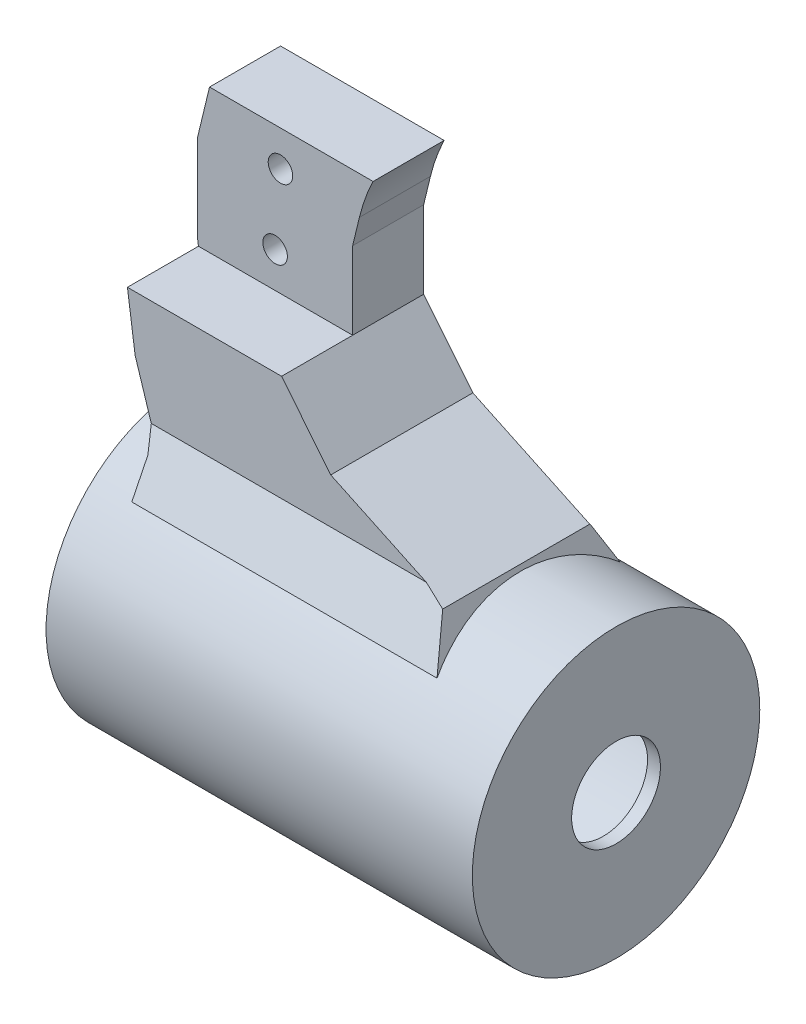
ISO-10303-21;
HEADER;
FILE_DESCRIPTION(('STEP AP214'),'2;1');
FILE_NAME('part.step','',(''),(''),'','','');
FILE_SCHEMA(('AUTOMOTIVE_DESIGN { 1 0 10303 214 1 1 1 1 }'));
ENDSEC;
DATA;
#1=APPLICATION_CONTEXT('core data for automotive mechanical design processes');
#2=APPLICATION_PROTOCOL_DEFINITION('international standard','automotive_design',2000,#1);
#3=PRODUCT_CONTEXT('',#1,'mechanical');
#4=PRODUCT('Part','Part','',(#3));
#5=PRODUCT_RELATED_PRODUCT_CATEGORY('part','',(#4));
#6=PRODUCT_DEFINITION_FORMATION('','',#4);
#7=PRODUCT_DEFINITION_CONTEXT('part definition',#1,'design');
#8=PRODUCT_DEFINITION('design','',#6,#7);
#9=PRODUCT_DEFINITION_SHAPE('','',#8);
#10=(LENGTH_UNIT() NAMED_UNIT(*) SI_UNIT(.MILLI.,.METRE.));
#11=(NAMED_UNIT(*) PLANE_ANGLE_UNIT() SI_UNIT($,.RADIAN.));
#12=(NAMED_UNIT(*) SI_UNIT($,.STERADIAN.) SOLID_ANGLE_UNIT());
#13=UNCERTAINTY_MEASURE_WITH_UNIT(LENGTH_MEASURE(1.E-05),#10,'distance_accuracy_value','');
#14=(GEOMETRIC_REPRESENTATION_CONTEXT(3) GLOBAL_UNCERTAINTY_ASSIGNED_CONTEXT((#13)) GLOBAL_UNIT_ASSIGNED_CONTEXT((#10,
#11,#12)) REPRESENTATION_CONTEXT('',''));
#15=CARTESIAN_POINT('',(0.,0.,0.));
#16=DIRECTION('',(0.,0.,1.));
#17=DIRECTION('',(1.,0.,0.));
#18=AXIS2_PLACEMENT_3D('',#15,#16,#17);
#19=CARTESIAN_POINT('',(-41.8993681465749,-27.4720647034177,0.));
#20=DIRECTION('',(0.,0.,-1.));
#21=DIRECTION('',(-1.,0.,0.));
#22=AXIS2_PLACEMENT_3D('',#19,#20,#21);
#23=PLANE('',#22);
#24=DIRECTION('',(-1.,0.,0.));
#25=VECTOR('',#24,1.);
#26=CARTESIAN_POINT('',(-70.78651792668,-37.0753078944647,0.));
#27=LINE('',#26,#25);
#28=CARTESIAN_POINT('',(-70.78651792668,-37.0753078944647,0.));
#29=VERTEX_POINT('',#28);
#30=CARTESIAN_POINT('',(-94.6542904517229,-37.0753078944647,0.));
#31=VERTEX_POINT('',#30);
#32=EDGE_CURVE('E129',#29,#31,#27,.T.);
#33=ORIENTED_EDGE('',*,*,#32,.F.);
#34=DIRECTION('',(0.,-1.,0.));
#35=VECTOR('',#34,1.);
#36=CARTESIAN_POINT('',(-70.78651792668,-25.0753078944647,0.));
#37=LINE('',#36,#35);
#38=CARTESIAN_POINT('',(-70.78651792668,-25.0753078944647,0.));
#39=VERTEX_POINT('',#38);
#40=EDGE_CURVE('E167',#39,#29,#37,.T.);
#41=ORIENTED_EDGE('',*,*,#40,.F.);
#42=DIRECTION('',(-0.234984789191742,-0.971999047761114,0.));
#43=VECTOR('',#42,1.);
#44=CARTESIAN_POINT('',(-69.738862808107,-20.7417517475428,0.));
#45=LINE('',#44,#43);
#46=CARTESIAN_POINT('',(-69.738862808107,-20.7417517475428,0.));
#47=VERTEX_POINT('',#46);
#48=EDGE_CURVE('E164',#47,#39,#45,.T.);
#49=ORIENTED_EDGE('',*,*,#48,.F.);
#50=CARTESIAN_POINT('',(-41.8993681465749,-27.4720647034177,0.));
#51=DIRECTION('',(0.,0.,1.));
#52=DIRECTION('',(-1.,0.,0.));
#53=AXIS2_PLACEMENT_3D('',#50,#51,#52);
#54=CIRCLE('',#53,28.6414834722905);
#55=CARTESIAN_POINT('',(-67.6192286908768,-14.8695511019509,0.));
#56=VERTEX_POINT('',#55);
#57=EDGE_CURVE('E160',#56,#47,#54,.T.);
#58=ORIENTED_EDGE('',*,*,#57,.F.);
#59=DIRECTION('',(1.,0.,0.));
#60=VECTOR('',#59,1.);
#61=CARTESIAN_POINT('',(-92.9418253522619,-14.8695511019509,0.));
#62=LINE('',#61,#60);
#63=CARTESIAN_POINT('',(-92.9418253522619,-14.8695511019509,0.));
#64=VERTEX_POINT('',#63);
#65=EDGE_CURVE('E156',#64,#56,#62,.T.);
#66=ORIENTED_EDGE('',*,*,#65,.F.);
#67=DIRECTION('',(0.23498478919174,0.971999047761115,0.));
#68=VECTOR('',#67,1.);
#69=CARTESIAN_POINT('',(-94.78651792668,-22.4999999999998,0.));
#70=LINE('',#69,#68);
#71=CARTESIAN_POINT('',(-94.78651792668,-22.4999999999998,0.));
#72=VERTEX_POINT('',#71);
#73=EDGE_CURVE('E152',#72,#64,#70,.T.);
#74=ORIENTED_EDGE('',*,*,#73,.F.);
#75=DIRECTION('',(0.,1.,0.));
#76=VECTOR('',#75,1.);
#77=CARTESIAN_POINT('',(-94.78651792668,-36.1278671988072,0.));
#78=LINE('',#77,#76);
#79=CARTESIAN_POINT('',(-94.78651792668,-36.1278671988072,0.));
#80=VERTEX_POINT('',#79);
#81=EDGE_CURVE('E131',#80,#72,#78,.T.);
#82=ORIENTED_EDGE('',*,*,#81,.F.);
#83=DIRECTION('',(-0.138223150744581,0.990401110963755,0.));
#84=VECTOR('',#83,1.);
#85=CARTESIAN_POINT('',(-94.6542904517229,-37.0753078944647,0.));
#86=LINE('',#85,#84);
#87=EDGE_CURVE('E119',#31,#80,#86,.T.);
#88=ORIENTED_EDGE('',*,*,#87,.F.);
#89=EDGE_LOOP('',(#33,#41,#49,#58,#66,#74,#82,#88));
#90=FACE_BOUND('',#89,.T.);
#91=CARTESIAN_POINT('',(-82.78651792668,-31.5753078944647,0.));
#92=DIRECTION('',(0.,0.,-1.));
#93=DIRECTION('',(-1.,0.,0.));
#94=AXIS2_PLACEMENT_3D('',#91,#92,#93);
#95=CIRCLE('',#94,1.89999999999999);
#96=CARTESIAN_POINT('',(-84.68651792668,-31.5753078944647,0.));
#97=VERTEX_POINT('',#96);
#98=EDGE_CURVE('E143',#97,#97,#95,.T.);
#99=ORIENTED_EDGE('',*,*,#98,.T.);
#100=EDGE_LOOP('',(#99));
#101=FACE_BOUND('',#100,.T.);
#102=CARTESIAN_POINT('',(-81.960177429347,-20.3695511019509,0.));
#103=DIRECTION('',(0.,0.,-1.));
#104=DIRECTION('',(-1.,0.,0.));
#105=AXIS2_PLACEMENT_3D('',#102,#103,#104);
#106=CIRCLE('',#105,1.89999999999999);
#107=CARTESIAN_POINT('',(-83.860177429347,-20.3695511019509,0.));
#108=VERTEX_POINT('',#107);
#109=EDGE_CURVE('E146',#108,#108,#106,.T.);
#110=ORIENTED_EDGE('',*,*,#109,.T.);
#111=EDGE_LOOP('',(#110));
#112=FACE_BOUND('',#111,.T.);
#113=ADVANCED_FACE('F61',(#90,#101,#112),#23,.F.);
#114=CARTESIAN_POINT('',(-70.78651792668,-37.0753078944647,-46.0878503067666));
#115=DIRECTION('',(0.,1.,0.));
#116=DIRECTION('',(0.,0.,1.));
#117=AXIS2_PLACEMENT_3D('',#114,#115,#116);
#118=PLANE('',#117);
#119=DIRECTION('',(0.,0.,1.));
#120=VECTOR('',#119,1.);
#121=CARTESIAN_POINT('',(-94.6542904517229,-37.0753078944647,-46.0878503067666));
#122=LINE('',#121,#120);
#123=CARTESIAN_POINT('',(-94.6542904517229,-37.0753078944647,-11.));
#124=VERTEX_POINT('',#123);
#125=EDGE_CURVE('E116',#124,#31,#122,.T.);
#126=ORIENTED_EDGE('',*,*,#125,.F.);
#127=DIRECTION('',(1.,0.,0.));
#128=VECTOR('',#127,1.);
#129=CARTESIAN_POINT('',(-70.78651792668,-37.0753078944647,-11.));
#130=LINE('',#129,#128);
#131=CARTESIAN_POINT('',(-70.78651792668,-37.0753078944647,-11.));
#132=VERTEX_POINT('',#131);
#133=EDGE_CURVE('E78',#124,#132,#130,.T.);
#134=ORIENTED_EDGE('',*,*,#133,.T.);
#135=DIRECTION('',(0.,0.,1.));
#136=VECTOR('',#135,1.);
#137=CARTESIAN_POINT('',(-70.78651792668,-37.0753078944647,-46.0878503067666));
#138=LINE('',#137,#136);
#139=EDGE_CURVE('E136',#132,#29,#138,.T.);
#140=ORIENTED_EDGE('',*,*,#139,.T.);
#141=ORIENTED_EDGE('',*,*,#32,.T.);
#142=EDGE_LOOP('',(#126,#134,#140,#141));
#143=FACE_BOUND('',#142,.T.);
#144=ADVANCED_FACE('F134',(#143),#118,.F.);
#145=CARTESIAN_POINT('',(-94.6542904517229,-37.0753078944647,-46.0878503067666));
#146=DIRECTION('',(0.990401110963755,0.138223150744581,0.));
#147=DIRECTION('',(-0.138223150744581,0.990401110963755,0.));
#148=AXIS2_PLACEMENT_3D('',#145,#146,#147);
#149=PLANE('',#148);
#150=DIRECTION('',(0.,0.,1.));
#151=VECTOR('',#150,1.);
#152=CARTESIAN_POINT('',(-94.78651792668,-36.1278671988072,-46.0878503067666));
#153=LINE('',#152,#151);
#154=CARTESIAN_POINT('',(-94.78651792668,-36.1278671988072,-11.));
#155=VERTEX_POINT('',#154);
#156=EDGE_CURVE('E111',#155,#80,#153,.T.);
#157=ORIENTED_EDGE('',*,*,#156,.F.);
#158=DIRECTION('',(0.138223150744581,-0.990401110963755,0.));
#159=VECTOR('',#158,1.);
#160=CARTESIAN_POINT('',(-94.6542904517229,-37.0753078944647,-11.));
#161=LINE('',#160,#159);
#162=EDGE_CURVE('E121',#155,#124,#161,.T.);
#163=ORIENTED_EDGE('',*,*,#162,.T.);
#164=ORIENTED_EDGE('',*,*,#125,.T.);
#165=ORIENTED_EDGE('',*,*,#87,.T.);
#166=EDGE_LOOP('',(#157,#163,#164,#165));
#167=FACE_BOUND('',#166,.T.);
#168=ADVANCED_FACE('F118',(#167),#149,.F.);
#169=CARTESIAN_POINT('',(-94.78651792668,-36.1278671988072,-46.0878503067666));
#170=DIRECTION('',(1.,0.,0.));
#171=DIRECTION('',(0.,0.,-1.));
#172=AXIS2_PLACEMENT_3D('',#169,#170,#171);
#173=PLANE('',#172);
#174=DIRECTION('',(0.,0.,1.));
#175=VECTOR('',#174,1.);
#176=CARTESIAN_POINT('',(-94.78651792668,-22.4999999999998,-46.0878503067666));
#177=LINE('',#176,#175);
#178=CARTESIAN_POINT('',(-94.78651792668,-22.4999999999998,-11.));
#179=VERTEX_POINT('',#178);
#180=EDGE_CURVE('E150',#179,#72,#177,.T.);
#181=ORIENTED_EDGE('',*,*,#180,.F.);
#182=DIRECTION('',(0.,-1.,0.));
#183=VECTOR('',#182,1.);
#184=CARTESIAN_POINT('',(-94.78651792668,-36.1278671988072,-11.));
#185=LINE('',#184,#183);
#186=EDGE_CURVE('E132',#179,#155,#185,.T.);
#187=ORIENTED_EDGE('',*,*,#186,.T.);
#188=ORIENTED_EDGE('',*,*,#156,.T.);
#189=ORIENTED_EDGE('',*,*,#81,.T.);
#190=EDGE_LOOP('',(#181,#187,#188,#189));
#191=FACE_BOUND('',#190,.T.);
#192=ADVANCED_FACE('F195',(#191),#173,.F.);
#193=CARTESIAN_POINT('',(-94.78651792668,-22.4999999999998,-46.0878503067666));
#194=DIRECTION('',(0.971999047761115,-0.23498478919174,0.));
#195=DIRECTION('',(0.23498478919174,0.971999047761115,0.));
#196=AXIS2_PLACEMENT_3D('',#193,#194,#195);
#197=PLANE('',#196);
#198=DIRECTION('',(0.,0.,1.));
#199=VECTOR('',#198,1.);
#200=CARTESIAN_POINT('',(-92.9418253522619,-14.8695511019509,-46.0878503067666));
#201=LINE('',#200,#199);
#202=CARTESIAN_POINT('',(-92.9418253522619,-14.8695511019509,-11.));
#203=VERTEX_POINT('',#202);
#204=EDGE_CURVE('E154',#203,#64,#201,.T.);
#205=ORIENTED_EDGE('',*,*,#204,.F.);
#206=DIRECTION('',(-0.23498478919174,-0.971999047761115,0.));
#207=VECTOR('',#206,1.);
#208=CARTESIAN_POINT('',(-94.78651792668,-22.4999999999998,-11.));
#209=LINE('',#208,#207);
#210=EDGE_CURVE('E153',#203,#179,#209,.T.);
#211=ORIENTED_EDGE('',*,*,#210,.T.);
#212=ORIENTED_EDGE('',*,*,#180,.T.);
#213=ORIENTED_EDGE('',*,*,#73,.T.);
#214=EDGE_LOOP('',(#205,#211,#212,#213));
#215=FACE_BOUND('',#214,.T.);
#216=ADVANCED_FACE('F201',(#215),#197,.F.);
#217=CARTESIAN_POINT('',(-92.9418253522619,-14.8695511019509,-46.0878503067666));
#218=DIRECTION('',(0.,-1.,0.));
#219=DIRECTION('',(1.,0.,0.));
#220=AXIS2_PLACEMENT_3D('',#217,#218,#219);
#221=PLANE('',#220);
#222=DIRECTION('',(0.,0.,1.));
#223=VECTOR('',#222,1.);
#224=CARTESIAN_POINT('',(-67.6192286908768,-14.8695511019509,-46.0878503067666));
#225=LINE('',#224,#223);
#226=CARTESIAN_POINT('',(-67.6192286908768,-14.8695511019509,-11.));
#227=VERTEX_POINT('',#226);
#228=EDGE_CURVE('E158',#227,#56,#225,.T.);
#229=ORIENTED_EDGE('',*,*,#228,.F.);
#230=DIRECTION('',(-1.,0.,0.));
#231=VECTOR('',#230,1.);
#232=CARTESIAN_POINT('',(-92.9418253522619,-14.8695511019509,-11.));
#233=LINE('',#232,#231);
#234=EDGE_CURVE('E157',#227,#203,#233,.T.);
#235=ORIENTED_EDGE('',*,*,#234,.T.);
#236=ORIENTED_EDGE('',*,*,#204,.T.);
#237=ORIENTED_EDGE('',*,*,#65,.T.);
#238=EDGE_LOOP('',(#229,#235,#236,#237));
#239=FACE_BOUND('',#238,.T.);
#240=ADVANCED_FACE('F242',(#239),#221,.F.);
#241=CARTESIAN_POINT('',(-41.8993681465749,-27.4720647034177,-46.0878503067666));
#242=DIRECTION('',(0.,0.,1.));
#243=DIRECTION('',(1.,0.,0.));
#244=AXIS2_PLACEMENT_3D('',#241,#242,#243);
#245=CYLINDRICAL_SURFACE('',#244,28.6414834722905);
#246=DIRECTION('',(0.,0.,1.));
#247=VECTOR('',#246,1.);
#248=CARTESIAN_POINT('',(-69.738862808107,-20.7417517475428,-46.0878503067666));
#249=LINE('',#248,#247);
#250=CARTESIAN_POINT('',(-69.738862808107,-20.7417517475428,-11.));
#251=VERTEX_POINT('',#250);
#252=EDGE_CURVE('E162',#251,#47,#249,.T.);
#253=ORIENTED_EDGE('',*,*,#252,.F.);
#254=CARTESIAN_POINT('',(-41.8993681465749,-27.4720647034177,-11.));
#255=DIRECTION('',(0.,0.,1.));
#256=DIRECTION('',(1.,0.,0.));
#257=AXIS2_PLACEMENT_3D('',#254,#255,#256);
#258=CIRCLE('',#257,28.6414834722905);
#259=EDGE_CURVE('E161',#251,#227,#258,.F.);
#260=ORIENTED_EDGE('',*,*,#259,.T.);
#261=ORIENTED_EDGE('',*,*,#228,.T.);
#262=ORIENTED_EDGE('',*,*,#57,.T.);
#263=EDGE_LOOP('',(#253,#260,#261,#262));
#264=FACE_BOUND('',#263,.T.);
#265=ADVANCED_FACE('F215',(#264),#245,.F.);
#266=CARTESIAN_POINT('',(-69.738862808107,-20.7417517475428,-46.0878503067666));
#267=DIRECTION('',(-0.971999047761114,0.234984789191742,0.));
#268=DIRECTION('',(-0.234984789191742,-0.971999047761114,0.));
#269=AXIS2_PLACEMENT_3D('',#266,#267,#268);
#270=PLANE('',#269);
#271=DIRECTION('',(0.,0.,1.));
#272=VECTOR('',#271,1.);
#273=CARTESIAN_POINT('',(-70.78651792668,-25.0753078944647,-46.0878503067666));
#274=LINE('',#273,#272);
#275=CARTESIAN_POINT('',(-70.78651792668,-25.0753078944647,-11.));
#276=VERTEX_POINT('',#275);
#277=EDGE_CURVE('E166',#276,#39,#274,.T.);
#278=ORIENTED_EDGE('',*,*,#277,.F.);
#279=DIRECTION('',(0.234984789191742,0.971999047761114,0.));
#280=VECTOR('',#279,1.);
#281=CARTESIAN_POINT('',(-69.738862808107,-20.7417517475428,-11.));
#282=LINE('',#281,#280);
#283=EDGE_CURVE('E165',#276,#251,#282,.T.);
#284=ORIENTED_EDGE('',*,*,#283,.T.);
#285=ORIENTED_EDGE('',*,*,#252,.T.);
#286=ORIENTED_EDGE('',*,*,#48,.T.);
#287=EDGE_LOOP('',(#278,#284,#285,#286));
#288=FACE_BOUND('',#287,.T.);
#289=ADVANCED_FACE('F216',(#288),#270,.F.);
#290=CARTESIAN_POINT('',(-70.78651792668,-25.0753078944647,-46.0878503067666));
#291=DIRECTION('',(-1.,0.,0.));
#292=DIRECTION('',(0.,0.,1.));
#293=AXIS2_PLACEMENT_3D('',#290,#291,#292);
#294=PLANE('',#293);
#295=ORIENTED_EDGE('',*,*,#139,.F.);
#296=DIRECTION('',(0.,1.,0.));
#297=VECTOR('',#296,1.);
#298=CARTESIAN_POINT('',(-70.78651792668,-25.0753078944647,-11.));
#299=LINE('',#298,#297);
#300=EDGE_CURVE('E168',#132,#276,#299,.T.);
#301=ORIENTED_EDGE('',*,*,#300,.T.);
#302=ORIENTED_EDGE('',*,*,#277,.T.);
#303=ORIENTED_EDGE('',*,*,#40,.T.);
#304=EDGE_LOOP('',(#295,#301,#302,#303));
#305=FACE_BOUND('',#304,.T.);
#306=ADVANCED_FACE('F217',(#305),#294,.F.);
#307=CARTESIAN_POINT('',(-82.78651792668,-31.5753078944647,-46.0878503067666));
#308=DIRECTION('',(0.,0.,1.));
#309=DIRECTION('',(1.,0.,0.));
#310=AXIS2_PLACEMENT_3D('',#307,#308,#309);
#311=CYLINDRICAL_SURFACE('',#310,1.89999999999999);
#312=CARTESIAN_POINT('',(-82.78651792668,-31.5753078944647,-11.));
#313=DIRECTION('',(0.,0.,1.));
#314=DIRECTION('',(1.,0.,0.));
#315=AXIS2_PLACEMENT_3D('',#312,#313,#314);
#316=CIRCLE('',#315,1.89999999999999);
#317=CARTESIAN_POINT('',(-80.88651792668,-31.5753078944647,-11.));
#318=VERTEX_POINT('',#317);
#319=EDGE_CURVE('E12',#318,#318,#316,.T.);
#320=ORIENTED_EDGE('',*,*,#319,.F.);
#321=EDGE_LOOP('',(#320));
#322=FACE_BOUND('',#321,.T.);
#323=ORIENTED_EDGE('',*,*,#98,.F.);
#324=EDGE_LOOP('',(#323));
#325=FACE_BOUND('',#324,.T.);
#326=ADVANCED_FACE('F226',(#322,#325),#311,.F.);
#327=CARTESIAN_POINT('',(-81.960177429347,-20.3695511019509,-46.0878503067666));
#328=DIRECTION('',(0.,0.,1.));
#329=DIRECTION('',(1.,0.,0.));
#330=AXIS2_PLACEMENT_3D('',#327,#328,#329);
#331=CYLINDRICAL_SURFACE('',#330,1.89999999999999);
#332=CARTESIAN_POINT('',(-81.960177429347,-20.3695511019509,-11.));
#333=DIRECTION('',(0.,0.,1.));
#334=DIRECTION('',(1.,0.,0.));
#335=AXIS2_PLACEMENT_3D('',#332,#333,#334);
#336=CIRCLE('',#335,1.89999999999999);
#337=CARTESIAN_POINT('',(-80.060177429347,-20.3695511019509,-11.));
#338=VERTEX_POINT('',#337);
#339=EDGE_CURVE('E65',#338,#338,#336,.T.);
#340=ORIENTED_EDGE('',*,*,#339,.F.);
#341=EDGE_LOOP('',(#340));
#342=FACE_BOUND('',#341,.T.);
#343=ORIENTED_EDGE('',*,*,#109,.F.);
#344=EDGE_LOOP('',(#343));
#345=FACE_BOUND('',#344,.T.);
#346=ADVANCED_FACE('F223',(#342,#345),#331,.F.);
#347=CARTESIAN_POINT('',(0.,0.,-11.));
#348=DIRECTION('',(0.,0.,1.));
#349=DIRECTION('',(1.,0.,0.));
#350=AXIS2_PLACEMENT_3D('',#347,#348,#349);
#351=PLANE('',#350);
#352=ORIENTED_EDGE('',*,*,#339,.T.);
#353=EDGE_LOOP('',(#352));
#354=FACE_BOUND('',#353,.T.);
#355=ORIENTED_EDGE('',*,*,#319,.T.);
#356=EDGE_LOOP('',(#355));
#357=FACE_BOUND('',#356,.T.);
#358=ORIENTED_EDGE('',*,*,#162,.F.);
#359=ORIENTED_EDGE('',*,*,#186,.F.);
#360=ORIENTED_EDGE('',*,*,#210,.F.);
#361=ORIENTED_EDGE('',*,*,#234,.F.);
#362=ORIENTED_EDGE('',*,*,#259,.F.);
#363=ORIENTED_EDGE('',*,*,#283,.F.);
#364=ORIENTED_EDGE('',*,*,#300,.F.);
#365=ORIENTED_EDGE('',*,*,#133,.F.);
#366=EDGE_LOOP('',(#358,#359,#360,#361,#362,#363,#364,#365));
#367=FACE_BOUND('',#366,.T.);
#368=ADVANCED_FACE('F63',(#354,#357,#367),#351,.F.);
#369=CLOSED_SHELL('',(#113,#144,#168,#192,#216,#240,#265,#289,#306,#326,#346,#368));
#370=MANIFOLD_SOLID_BREP('B2',#369);
#371=CARTESIAN_POINT('',(-96.,-78.,0.));
#372=DIRECTION('',(1.,0.,0.));
#373=DIRECTION('',(0.,0.,-1.));
#374=AXIS2_PLACEMENT_3D('',#371,#372,#373);
#375=CYLINDRICAL_SURFACE('',#374,19.15);
#376=CARTESIAN_POINT('',(-96.,-78.,0.));
#377=DIRECTION('',(1.,0.,0.));
#378=DIRECTION('',(0.,0.,-1.));
#379=AXIS2_PLACEMENT_3D('',#376,#377,#378);
#380=CIRCLE('',#379,19.15);
#381=CARTESIAN_POINT('',(-96.,-78.,-19.15));
#382=VERTEX_POINT('',#381);
#383=EDGE_CURVE('E1127',#382,#382,#380,.T.);
#384=ORIENTED_EDGE('',*,*,#383,.F.);
#385=EDGE_LOOP('',(#384));
#386=FACE_BOUND('',#385,.T.);
#387=CARTESIAN_POINT('',(-32.,-78.,0.));
#388=DIRECTION('',(1.,0.,0.));
#389=DIRECTION('',(0.,0.,-1.));
#390=AXIS2_PLACEMENT_3D('',#387,#388,#389);
#391=CIRCLE('',#390,19.15);
#392=CARTESIAN_POINT('',(-32.,-78.,-19.15));
#393=VERTEX_POINT('',#392);
#394=EDGE_CURVE('E59',#393,#393,#391,.F.);
#395=ORIENTED_EDGE('',*,*,#394,.F.);
#396=EDGE_LOOP('',(#395));
#397=FACE_BOUND('',#396,.T.);
#398=ADVANCED_FACE('F332',(#386,#397),#375,.F.);
#399=CARTESIAN_POINT('',(-90.,-99.502,11.));
#400=DIRECTION('',(1.,0.,0.));
#401=DIRECTION('',(0.,1.,0.));
#402=AXIS2_PLACEMENT_3D('',#399,#400,#401);
#403=PLANE('',#402);
#404=DIRECTION('',(0.,-0.896679754505562,-0.442679814154481));
#405=VECTOR('',#404,1.);
#406=CARTESIAN_POINT('',(-90.,-82.0418779550366,-24.3667310961946));
#407=LINE('',#406,#405);
#408=CARTESIAN_POINT('',(-90.,-56.5,-11.7570187329142));
#409=VERTEX_POINT('',#408);
#410=CARTESIAN_POINT('',(-90.,-60.4883017358116,-13.7259944595655));
#411=VERTEX_POINT('',#410);
#412=EDGE_CURVE('E866',#409,#411,#407,.T.);
#413=ORIENTED_EDGE('',*,*,#412,.T.);
#414=CARTESIAN_POINT('',(-90.,-78.,0.));
#415=DIRECTION('',(1.,0.,0.));
#416=DIRECTION('',(0.,0.,-1.));
#417=AXIS2_PLACEMENT_3D('',#414,#415,#416);
#418=CIRCLE('',#417,22.25);
#419=CARTESIAN_POINT('',(-90.,-56.5,-5.72821961869481));
#420=VERTEX_POINT('',#419);
#421=EDGE_CURVE('E348',#411,#420,#418,.T.);
#422=ORIENTED_EDGE('',*,*,#421,.T.);
#423=DIRECTION('',(0.,0.,1.));
#424=VECTOR('',#423,1.);
#425=CARTESIAN_POINT('',(-90.,-56.5,12.4867771165008));
#426=LINE('',#425,#424);
#427=EDGE_CURVE('E799',#409,#420,#426,.T.);
#428=ORIENTED_EDGE('',*,*,#427,.F.);
#429=EDGE_LOOP('',(#413,#422,#428));
#430=FACE_BOUND('',#429,.T.);
#431=ADVANCED_FACE('F881',(#430),#403,.F.);
#432=CARTESIAN_POINT('',(-90.,-56.5,5.72821961869483));
#433=VERTEX_POINT('',#432);
#434=CARTESIAN_POINT('',(-90.,-56.5,12.4867771165008));
#435=VERTEX_POINT('',#434);
#436=EDGE_CURVE('E858',#433,#435,#426,.T.);
#437=ORIENTED_EDGE('',*,*,#436,.F.);
#438=CARTESIAN_POINT('',(-90.,-61.5465446919955,14.9781944314894));
#439=VERTEX_POINT('',#438);
#440=EDGE_CURVE('E1118',#433,#439,#418,.T.);
#441=ORIENTED_EDGE('',*,*,#440,.T.);
#442=DIRECTION('',(0.,0.896679754505563,-0.442679814154478));
#443=VECTOR('',#442,1.);
#444=CARTESIAN_POINT('',(-90.,-90.4849307787501,29.2647212661215));
#445=LINE('',#444,#443);
#446=EDGE_CURVE('E433',#439,#435,#445,.T.);
#447=ORIENTED_EDGE('',*,*,#446,.T.);
#448=EDGE_LOOP('',(#437,#441,#447));
#449=FACE_BOUND('',#448,.T.);
#450=ADVANCED_FACE('F915',(#449),#403,.F.);
#451=CARTESIAN_POINT('',(-29.471892703518,-62.4156191809848,11.));
#452=DIRECTION('',(0.42698083978432,0.904260671740775,0.));
#453=DIRECTION('',(0.,0.,-1.));
#454=AXIS2_PLACEMENT_3D('',#451,#452,#453);
#455=PLANE('',#454);
#456=DIRECTION('',(0.,0.,-1.));
#457=VECTOR('',#456,1.);
#458=CARTESIAN_POINT('',(-45.0744862839186,-55.0482651447333,0.));
#459=LINE('',#458,#457);
#460=CARTESIAN_POINT('',(-45.0744862839186,-55.0482651447333,11.7700733962463));
#461=VERTEX_POINT('',#460);
#462=CARTESIAN_POINT('',(-45.0744862839186,-55.0482651447333,-11.0403150126597));
#463=VERTEX_POINT('',#462);
#464=EDGE_CURVE('E686',#461,#463,#459,.T.);
#465=ORIENTED_EDGE('',*,*,#464,.T.);
#466=DIRECTION('',(-0.884816093206044,0.417799347398912,0.206262421484466));
#467=VECTOR('',#466,1.);
#468=CARTESIAN_POINT('',(-86.5473912286674,-35.4652661987385,-1.37242824434456));
#469=LINE('',#468,#467);
#470=CARTESIAN_POINT('',(-45.2474279751019,-54.966604191379,-11.));
#471=VERTEX_POINT('',#470);
#472=EDGE_CURVE('E870',#463,#471,#469,.T.);
#473=ORIENTED_EDGE('',*,*,#472,.T.);
#474=DIRECTION('',(0.904260671740775,-0.42698083978432,0.));
#475=VECTOR('',#474,1.);
#476=CARTESIAN_POINT('',(-29.471892703518,-62.4156191809848,-11.));
#477=LINE('',#476,#475);
#478=CARTESIAN_POINT('',(-63.1780152054959,-46.5,-11.));
#479=VERTEX_POINT('',#478);
#480=EDGE_CURVE('E432',#479,#471,#477,.T.);
#481=ORIENTED_EDGE('',*,*,#480,.F.);
#482=DIRECTION('',(0.,0.,-1.));
#483=VECTOR('',#482,1.);
#484=CARTESIAN_POINT('',(-63.1780152054959,-46.5,11.));
#485=LINE('',#484,#483);
#486=CARTESIAN_POINT('',(-63.1780152054959,-46.5,11.));
#487=VERTEX_POINT('',#486);
#488=EDGE_CURVE('E448',#487,#479,#485,.T.);
#489=ORIENTED_EDGE('',*,*,#488,.F.);
#490=DIRECTION('',(0.904260671740775,-0.42698083978432,0.));
#491=VECTOR('',#490,1.);
#492=CARTESIAN_POINT('',(-29.471892703518,-62.4156191809848,11.));
#493=LINE('',#492,#491);
#494=CARTESIAN_POINT('',(-48.3779156194455,-53.4884261780158,11.));
#495=VERTEX_POINT('',#494);
#496=EDGE_CURVE('E446',#487,#495,#493,.T.);
#497=ORIENTED_EDGE('',*,*,#496,.T.);
#498=DIRECTION('',(0.884816093206045,-0.417799347398913,0.206262421484465));
#499=VECTOR('',#498,1.);
#500=CARTESIAN_POINT('',(-87.2270216026564,-35.1443530407328,1.94375573169227));
#501=LINE('',#500,#499);
#502=EDGE_CURVE('E798',#495,#461,#501,.T.);
#503=ORIENTED_EDGE('',*,*,#502,.T.);
#504=EDGE_LOOP('',(#465,#473,#481,#489,#497,#503));
#505=FACE_BOUND('',#504,.T.);
#506=ADVANCED_FACE('F836',(#505),#455,.T.);
#507=CARTESIAN_POINT('',(-60.9770040591636,-49.2264040160328,11.));
#508=DIRECTION('',(0.778092434340065,0.628149793936726,0.));
#509=DIRECTION('',(0.,0.,-1.));
#510=AXIS2_PLACEMENT_3D('',#507,#508,#509);
#511=PLANE('',#510);
#512=DIRECTION('',(0.628149793936726,-0.778092434340065,0.));
#513=VECTOR('',#512,1.);
#514=CARTESIAN_POINT('',(-60.9770040591636,-49.2264040160328,-11.));
#515=LINE('',#514,#513);
#516=CARTESIAN_POINT('',(-70.78651792668,-37.0753078944647,-11.));
#517=VERTEX_POINT('',#516);
#518=EDGE_CURVE('E429',#517,#479,#515,.T.);
#519=ORIENTED_EDGE('',*,*,#518,.F.);
#520=DIRECTION('',(0.,0.,1.));
#521=VECTOR('',#520,1.);
#522=CARTESIAN_POINT('',(-70.78651792668,-37.0753078944647,0.));
#523=LINE('',#522,#521);
#524=CARTESIAN_POINT('',(-70.78651792668,-37.0753078944647,11.));
#525=VERTEX_POINT('',#524);
#526=EDGE_CURVE('E422',#517,#525,#523,.T.);
#527=ORIENTED_EDGE('',*,*,#526,.T.);
#528=DIRECTION('',(0.628149793936726,-0.778092434340065,0.));
#529=VECTOR('',#528,1.);
#530=CARTESIAN_POINT('',(-60.9770040591636,-49.2264040160328,11.));
#531=LINE('',#530,#529);
#532=EDGE_CURVE('E426',#525,#487,#531,.T.);
#533=ORIENTED_EDGE('',*,*,#532,.T.);
#534=ORIENTED_EDGE('',*,*,#488,.T.);
#535=EDGE_LOOP('',(#519,#527,#533,#534));
#536=FACE_BOUND('',#535,.T.);
#537=ADVANCED_FACE('F424',(#536),#511,.T.);
#538=CARTESIAN_POINT('',(0.,0.,11.));
#539=DIRECTION('',(0.,0.,1.));
#540=DIRECTION('',(1.,0.,0.));
#541=AXIS2_PLACEMENT_3D('',#538,#539,#540);
#542=PLANE('',#541);
#543=DIRECTION('',(1.,0.,0.));
#544=VECTOR('',#543,1.);
#545=CARTESIAN_POINT('',(-70.78651792668,-37.0753078944647,11.));
#546=LINE('',#545,#544);
#547=CARTESIAN_POINT('',(-94.6542904517229,-37.0753078944647,11.));
#548=VERTEX_POINT('',#547);
#549=EDGE_CURVE('E436',#548,#525,#546,.T.);
#550=ORIENTED_EDGE('',*,*,#549,.F.);
#551=DIRECTION('',(0.138223150744598,-0.990401110963753,0.));
#552=VECTOR('',#551,1.);
#553=CARTESIAN_POINT('',(-97.9213344834683,-13.6661754793973,11.));
#554=LINE('',#553,#552);
#555=CARTESIAN_POINT('',(-93.4649708547694,-45.5970601752398,11.));
#556=VERTEX_POINT('',#555);
#557=EDGE_CURVE('E872',#548,#556,#554,.T.);
#558=ORIENTED_EDGE('',*,*,#557,.T.);
#559=DIRECTION('',(0.302874523533555,-0.953030441798331,0.));
#560=VECTOR('',#559,1.);
#561=CARTESIAN_POINT('',(-98.0526802844433,-31.1612908883586,11.));
#562=LINE('',#561,#560);
#563=CARTESIAN_POINT('',(-90.9570827398739,-53.4884261780158,11.));
#564=VERTEX_POINT('',#563);
#565=EDGE_CURVE('E454',#564,#556,#562,.F.);
#566=ORIENTED_EDGE('',*,*,#565,.F.);
#567=DIRECTION('',(1.,0.,0.));
#568=VECTOR('',#567,1.);
#569=CARTESIAN_POINT('',(-42.,-53.4884261780158,11.));
#570=LINE('',#569,#568);
#571=EDGE_CURVE('E460',#564,#495,#570,.T.);
#572=ORIENTED_EDGE('',*,*,#571,.T.);
#573=ORIENTED_EDGE('',*,*,#496,.F.);
#574=ORIENTED_EDGE('',*,*,#532,.F.);
#575=EDGE_LOOP('',(#550,#558,#566,#572,#573,#574));
#576=FACE_BOUND('',#575,.T.);
#577=ADVANCED_FACE('F444',(#576),#542,.T.);
#578=CARTESIAN_POINT('',(0.,0.,-11.));
#579=DIRECTION('',(0.,0.,1.));
#580=DIRECTION('',(1.,0.,0.));
#581=AXIS2_PLACEMENT_3D('',#578,#579,#580);
#582=PLANE('',#581);
#583=DIRECTION('',(-0.302874523533555,0.953030441798331,0.));
#584=VECTOR('',#583,1.);
#585=CARTESIAN_POINT('',(-90.,-56.5,-11.));
#586=LINE('',#585,#584);
#587=CARTESIAN_POINT('',(-93.4649708547694,-45.5970601752398,-11.));
#588=VERTEX_POINT('',#587);
#589=CARTESIAN_POINT('',(-90.4873155195841,-54.966604191379,-11.));
#590=VERTEX_POINT('',#589);
#591=EDGE_CURVE('E463',#588,#590,#586,.F.);
#592=ORIENTED_EDGE('',*,*,#591,.F.);
#593=DIRECTION('',(-0.138223150744598,0.990401110963753,0.));
#594=VECTOR('',#593,1.);
#595=CARTESIAN_POINT('',(-94.78651792668,-36.1278671988072,-11.));
#596=LINE('',#595,#594);
#597=CARTESIAN_POINT('',(-94.6542904517229,-37.0753078944647,-11.));
#598=VERTEX_POINT('',#597);
#599=EDGE_CURVE('E356',#588,#598,#596,.T.);
#600=ORIENTED_EDGE('',*,*,#599,.T.);
#601=DIRECTION('',(-1.,0.,0.));
#602=VECTOR('',#601,1.);
#603=CARTESIAN_POINT('',(-70.78651792668,-37.0753078944647,-11.));
#604=LINE('',#603,#602);
#605=EDGE_CURVE('E886',#517,#598,#604,.T.);
#606=ORIENTED_EDGE('',*,*,#605,.F.);
#607=ORIENTED_EDGE('',*,*,#518,.T.);
#608=ORIENTED_EDGE('',*,*,#480,.T.);
#609=DIRECTION('',(-1.,0.,0.));
#610=VECTOR('',#609,1.);
#611=CARTESIAN_POINT('',(0.,-54.966604191379,-11.));
#612=LINE('',#611,#610);
#613=EDGE_CURVE('E861',#471,#590,#612,.T.);
#614=ORIENTED_EDGE('',*,*,#613,.T.);
#615=EDGE_LOOP('',(#592,#600,#606,#607,#608,#614));
#616=FACE_BOUND('',#615,.T.);
#617=ADVANCED_FACE('F885',(#616),#582,.F.);
#618=CARTESIAN_POINT('',(-98.,-53.4884261780158,11.));
#619=DIRECTION('',(0.,0.442679814154478,0.896679754505563));
#620=DIRECTION('',(1.,0.,0.));
#621=AXIS2_PLACEMENT_3D('',#618,#619,#620);
#622=PLANE('',#621);
#623=DIRECTION('',(1.,0.,0.));
#624=VECTOR('',#623,1.);
#625=CARTESIAN_POINT('',(-94.78651792668,-61.5465446919955,14.9781944314894));
#626=LINE('',#625,#624);
#627=CARTESIAN_POINT('',(-42.7447078451662,-61.5465446919955,14.9781944314894));
#628=VERTEX_POINT('',#627);
#629=EDGE_CURVE('E842',#628,#439,#626,.F.);
#630=ORIENTED_EDGE('',*,*,#629,.F.);
#631=DIRECTION('',(-0.30605332364349,0.85365201270775,-0.421437544942048));
#632=VECTOR('',#631,1.);
#633=CARTESIAN_POINT('',(-45.1738121689698,-54.7712227631035,11.6333009650672));
#634=LINE('',#633,#632);
#635=EDGE_CURVE('E794',#628,#461,#634,.T.);
#636=ORIENTED_EDGE('',*,*,#635,.T.);
#637=ORIENTED_EDGE('',*,*,#502,.F.);
#638=ORIENTED_EDGE('',*,*,#571,.F.);
#639=DIRECTION('',(-0.274055906121885,0.862349260154414,-0.425731269500899));
#640=VECTOR('',#639,1.);
#641=CARTESIAN_POINT('',(-90.,-56.5,12.4867771165008));
#642=LINE('',#641,#640);
#643=EDGE_CURVE('E853',#564,#435,#642,.F.);
#644=ORIENTED_EDGE('',*,*,#643,.T.);
#645=ORIENTED_EDGE('',*,*,#446,.F.);
#646=EDGE_LOOP('',(#630,#636,#637,#638,#644,#645));
#647=FACE_BOUND('',#646,.T.);
#648=ADVANCED_FACE('F839',(#647),#622,.T.);
#649=CARTESIAN_POINT('',(-45.0744862839186,-55.0482651447333,11.));
#650=DIRECTION('',(0.941329900196425,0.337487805699981,0.));
#651=DIRECTION('',(0.,0.,-1.));
#652=AXIS2_PLACEMENT_3D('',#649,#650,#651);
#653=PLANE('',#652);
#654=CARTESIAN_POINT('',(-36.8457764217381,-78.,0.));
#655=DIRECTION('',(0.941329900196425,0.337487805699981,0.));
#656=DIRECTION('',(0.337487805699981,-0.941329900196425,0.));
#657=AXIS2_PLACEMENT_3D('',#654,#655,#656);
#658=ELLIPSE('',#657,23.6367717580809,22.25);
#659=CARTESIAN_POINT('',(-43.1241115941658,-60.4883017358116,-13.7259944595655));
#660=VERTEX_POINT('',#659);
#661=EDGE_CURVE('E846',#660,#628,#658,.T.);
#662=ORIENTED_EDGE('',*,*,#661,.F.);
#663=DIRECTION('',(-0.30605332364349,0.853652012707749,0.42143754494205));
#664=VECTOR('',#663,1.);
#665=CARTESIAN_POINT('',(-50.0584819257399,-41.1467728808446,-4.1773185181737));
#666=LINE('',#665,#664);
#667=EDGE_CURVE('E848',#660,#463,#666,.T.);
#668=ORIENTED_EDGE('',*,*,#667,.T.);
#669=ORIENTED_EDGE('',*,*,#464,.F.);
#670=ORIENTED_EDGE('',*,*,#635,.F.);
#671=EDGE_LOOP('',(#662,#668,#669,#670));
#672=FACE_BOUND('',#671,.T.);
#673=ADVANCED_FACE('F845',(#672),#653,.T.);
#674=CARTESIAN_POINT('',(-90.,-56.5,12.4867771165008));
#675=DIRECTION('',(-0.953030441798331,-0.302874523533555,0.));
#676=DIRECTION('',(0.302874523533555,-0.953030441798331,0.));
#677=AXIS2_PLACEMENT_3D('',#674,#675,#676);
#678=PLANE('',#677);
#679=ORIENTED_EDGE('',*,*,#427,.T.);
#680=CARTESIAN_POINT('',(-83.1672673081839,-78.,0.));
#681=DIRECTION('',(-0.953030441798331,-0.302874523533555,0.));
#682=DIRECTION('',(0.302874523533555,-0.953030441798331,0.));
#683=AXIS2_PLACEMENT_3D('',#680,#681,#682);
#684=ELLIPSE('',#683,23.3465784765648,22.25);
#685=EDGE_CURVE('E1116',#420,#433,#684,.F.);
#686=ORIENTED_EDGE('',*,*,#685,.T.);
#687=ORIENTED_EDGE('',*,*,#436,.T.);
#688=ORIENTED_EDGE('',*,*,#643,.F.);
#689=ORIENTED_EDGE('',*,*,#565,.T.);
#690=DIRECTION('',(0.,0.,1.));
#691=VECTOR('',#690,1.);
#692=CARTESIAN_POINT('',(-93.4649708547694,-45.5970601752398,12.4867771165008));
#693=LINE('',#692,#691);
#694=EDGE_CURVE('E874',#556,#588,#693,.F.);
#695=ORIENTED_EDGE('',*,*,#694,.T.);
#696=ORIENTED_EDGE('',*,*,#591,.T.);
#697=DIRECTION('',(-0.274055906121884,0.862349260154413,0.425731269500901));
#698=VECTOR('',#697,1.);
#699=CARTESIAN_POINT('',(-92.8286247299538,-47.5993983758725,-7.36290070690339));
#700=LINE('',#699,#698);
#701=EDGE_CURVE('E864',#590,#409,#700,.F.);
#702=ORIENTED_EDGE('',*,*,#701,.T.);
#703=EDGE_LOOP('',(#679,#686,#687,#688,#689,#695,#696,#702));
#704=FACE_BOUND('',#703,.T.);
#705=ADVANCED_FACE('F883',(#704),#678,.T.);
#706=CARTESIAN_POINT('',(-98.,-54.966604191379,-11.));
#707=DIRECTION('',(0.,-0.442679814154481,0.896679754505562));
#708=DIRECTION('',(-1.,0.,0.));
#709=AXIS2_PLACEMENT_3D('',#706,#707,#708);
#710=PLANE('',#709);
#711=ORIENTED_EDGE('',*,*,#667,.F.);
#712=DIRECTION('',(1.,0.,0.));
#713=VECTOR('',#712,1.);
#714=CARTESIAN_POINT('',(-94.78651792668,-60.4883017358116,-13.7259944595655));
#715=LINE('',#714,#713);
#716=EDGE_CURVE('E341',#660,#411,#715,.F.);
#717=ORIENTED_EDGE('',*,*,#716,.T.);
#718=ORIENTED_EDGE('',*,*,#412,.F.);
#719=ORIENTED_EDGE('',*,*,#701,.F.);
#720=ORIENTED_EDGE('',*,*,#613,.F.);
#721=ORIENTED_EDGE('',*,*,#472,.F.);
#722=EDGE_LOOP('',(#711,#717,#718,#719,#720,#721));
#723=FACE_BOUND('',#722,.T.);
#724=ADVANCED_FACE('F879',(#723),#710,.F.);
#725=CARTESIAN_POINT('',(-70.78651792668,-37.0753078944647,0.));
#726=DIRECTION('',(0.,-1.,0.));
#727=DIRECTION('',(0.,0.,-1.));
#728=AXIS2_PLACEMENT_3D('',#725,#726,#727);
#729=PLANE('',#728);
#730=ORIENTED_EDGE('',*,*,#605,.T.);
#731=DIRECTION('',(0.,0.,1.));
#732=VECTOR('',#731,1.);
#733=CARTESIAN_POINT('',(-94.6542904517229,-37.0753078944647,0.));
#734=LINE('',#733,#732);
#735=EDGE_CURVE('E439',#598,#548,#734,.T.);
#736=ORIENTED_EDGE('',*,*,#735,.T.);
#737=ORIENTED_EDGE('',*,*,#549,.T.);
#738=ORIENTED_EDGE('',*,*,#526,.F.);
#739=EDGE_LOOP('',(#730,#736,#737,#738));
#740=FACE_BOUND('',#739,.T.);
#741=ADVANCED_FACE('F437',(#740),#729,.F.);
#742=CARTESIAN_POINT('',(-94.78651792668,-36.1278671988072,0.));
#743=DIRECTION('',(-0.990401110963753,-0.138223150744598,0.));
#744=DIRECTION('',(0.,0.,-1.));
#745=AXIS2_PLACEMENT_3D('',#742,#743,#744);
#746=PLANE('',#745);
#747=ORIENTED_EDGE('',*,*,#557,.F.);
#748=ORIENTED_EDGE('',*,*,#735,.F.);
#749=ORIENTED_EDGE('',*,*,#599,.F.);
#750=ORIENTED_EDGE('',*,*,#694,.F.);
#751=EDGE_LOOP('',(#747,#748,#749,#750));
#752=FACE_BOUND('',#751,.T.);
#753=ADVANCED_FACE('F335',(#752),#746,.T.);
#754=CARTESIAN_POINT('',(-96.,-78.,0.));
#755=DIRECTION('',(1.,0.,0.));
#756=DIRECTION('',(0.,0.,-1.));
#757=AXIS2_PLACEMENT_3D('',#754,#755,#756);
#758=CYLINDRICAL_SURFACE('',#757,22.25);
#759=CARTESIAN_POINT('',(-30.,-78.,0.));
#760=DIRECTION('',(1.,0.,0.));
#761=DIRECTION('',(0.,0.,-1.));
#762=AXIS2_PLACEMENT_3D('',#759,#760,#761);
#763=CIRCLE('',#762,22.25);
#764=CARTESIAN_POINT('',(-30.,-78.,-22.25));
#765=VERTEX_POINT('',#764);
#766=EDGE_CURVE('E1112',#765,#765,#763,.T.);
#767=ORIENTED_EDGE('',*,*,#766,.F.);
#768=EDGE_LOOP('',(#767));
#769=FACE_BOUND('',#768,.T.);
#770=CARTESIAN_POINT('',(-96.,-78.,0.));
#771=DIRECTION('',(1.,0.,0.));
#772=DIRECTION('',(0.,0.,-1.));
#773=AXIS2_PLACEMENT_3D('',#770,#771,#772);
#774=CIRCLE('',#773,22.25);
#775=CARTESIAN_POINT('',(-96.,-78.,-22.25));
#776=VERTEX_POINT('',#775);
#777=EDGE_CURVE('E1115',#776,#776,#774,.T.);
#778=ORIENTED_EDGE('',*,*,#777,.T.);
#779=EDGE_LOOP('',(#778));
#780=FACE_BOUND('',#779,.T.);
#781=ORIENTED_EDGE('',*,*,#685,.F.);
#782=ORIENTED_EDGE('',*,*,#421,.F.);
#783=ORIENTED_EDGE('',*,*,#716,.F.);
#784=ORIENTED_EDGE('',*,*,#661,.T.);
#785=ORIENTED_EDGE('',*,*,#629,.T.);
#786=ORIENTED_EDGE('',*,*,#440,.F.);
#787=EDGE_LOOP('',(#781,#782,#783,#784,#785,#786));
#788=FACE_BOUND('',#787,.T.);
#789=ADVANCED_FACE('F1024',(#769,#780,#788),#758,.T.);
#790=CARTESIAN_POINT('',(-96.,-78.,0.));
#791=DIRECTION('',(1.,0.,0.));
#792=DIRECTION('',(0.,0.,-1.));
#793=AXIS2_PLACEMENT_3D('',#790,#791,#792);
#794=PLANE('',#793);
#795=ORIENTED_EDGE('',*,*,#383,.T.);
#796=EDGE_LOOP('',(#795));
#797=FACE_BOUND('',#796,.T.);
#798=ORIENTED_EDGE('',*,*,#777,.F.);
#799=EDGE_LOOP('',(#798));
#800=FACE_BOUND('',#799,.T.);
#801=ADVANCED_FACE('F1067',(#797,#800),#794,.F.);
#802=CARTESIAN_POINT('',(-30.,-78.,0.));
#803=DIRECTION('',(1.,0.,0.));
#804=DIRECTION('',(0.,0.,-1.));
#805=AXIS2_PLACEMENT_3D('',#802,#803,#804);
#806=PLANE('',#805);
#807=ORIENTED_EDGE('',*,*,#766,.T.);
#808=EDGE_LOOP('',(#807));
#809=FACE_BOUND('',#808,.T.);
#810=CARTESIAN_POINT('',(-30.,-78.,0.));
#811=DIRECTION('',(1.,0.,0.));
#812=DIRECTION('',(0.,0.,-1.));
#813=AXIS2_PLACEMENT_3D('',#810,#811,#812);
#814=CIRCLE('',#813,6.875);
#815=CARTESIAN_POINT('',(-30.,-78.,-6.875));
#816=VERTEX_POINT('',#815);
#817=EDGE_CURVE('E442',#816,#816,#814,.T.);
#818=ORIENTED_EDGE('',*,*,#817,.F.);
#819=EDGE_LOOP('',(#818));
#820=FACE_BOUND('',#819,.T.);
#821=ADVANCED_FACE('F1071',(#809,#820),#806,.T.);
#822=CARTESIAN_POINT('',(-32.,-78.,0.));
#823=DIRECTION('',(1.,0.,0.));
#824=DIRECTION('',(0.,0.,-1.));
#825=AXIS2_PLACEMENT_3D('',#822,#823,#824);
#826=PLANE('',#825);
#827=CARTESIAN_POINT('',(-32.,-78.,0.));
#828=DIRECTION('',(1.,0.,0.));
#829=DIRECTION('',(0.,0.,-1.));
#830=AXIS2_PLACEMENT_3D('',#827,#828,#829);
#831=CIRCLE('',#830,6.875);
#832=CARTESIAN_POINT('',(-32.,-78.,-6.875));
#833=VERTEX_POINT('',#832);
#834=EDGE_CURVE('E1131',#833,#833,#831,.T.);
#835=ORIENTED_EDGE('',*,*,#834,.T.);
#836=EDGE_LOOP('',(#835));
#837=FACE_BOUND('',#836,.T.);
#838=ORIENTED_EDGE('',*,*,#394,.T.);
#839=EDGE_LOOP('',(#838));
#840=FACE_BOUND('',#839,.T.);
#841=ADVANCED_FACE('F1075',(#837,#840),#826,.F.);
#842=CARTESIAN_POINT('',(-32.,-78.,0.));
#843=DIRECTION('',(1.,0.,0.));
#844=DIRECTION('',(0.,0.,-1.));
#845=AXIS2_PLACEMENT_3D('',#842,#843,#844);
#846=CYLINDRICAL_SURFACE('',#845,6.875);
#847=ORIENTED_EDGE('',*,*,#834,.F.);
#848=EDGE_LOOP('',(#847));
#849=FACE_BOUND('',#848,.T.);
#850=ORIENTED_EDGE('',*,*,#817,.T.);
#851=EDGE_LOOP('',(#850));
#852=FACE_BOUND('',#851,.T.);
#853=ADVANCED_FACE('F1084',(#849,#852),#846,.F.);
#854=CLOSED_SHELL('',(#398,#431,#450,#506,#537,#577,#617,#648,#673,#705,#724,#741,#753,#789,
#801,#821,#841,#853));
#855=MANIFOLD_SOLID_BREP('B6',#854);
#856=ADVANCED_BREP_SHAPE_REPRESENTATION('',(#18,#370,#855),#14);
#857=SHAPE_DEFINITION_REPRESENTATION(#9,#856);
ENDSEC;
END-ISO-10303-21;
